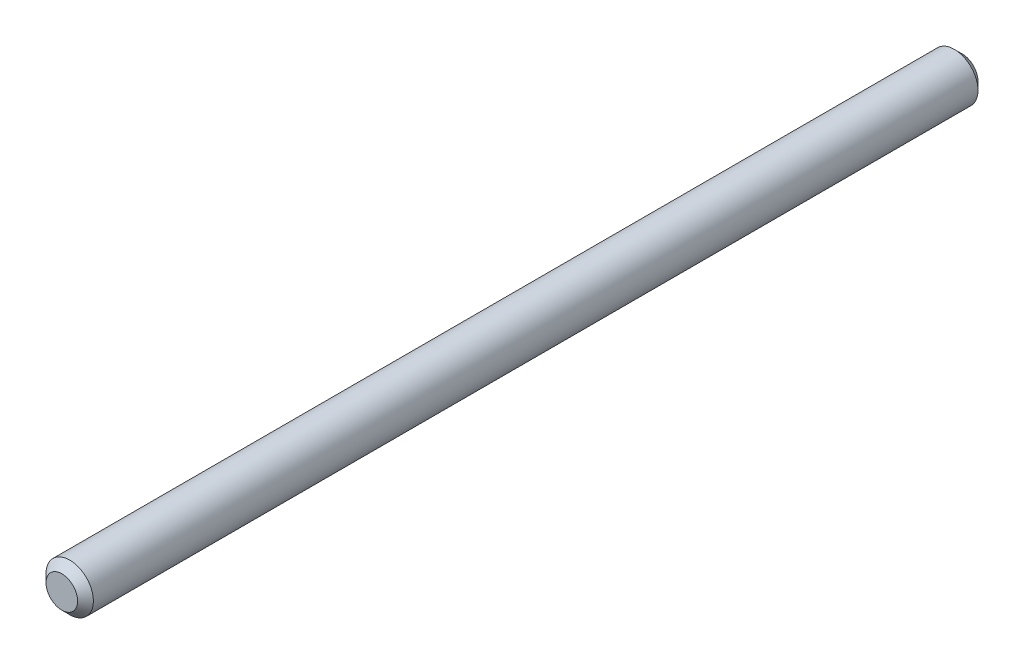
ISO-10303-21;
HEADER;
FILE_DESCRIPTION(('STEP AP214'),'2;1');
FILE_NAME('part.step','',(''),(''),'','','');
FILE_SCHEMA(('AUTOMOTIVE_DESIGN { 1 0 10303 214 1 1 1 1 }'));
ENDSEC;
DATA;
#1=APPLICATION_CONTEXT('core data for automotive mechanical design processes');
#2=APPLICATION_PROTOCOL_DEFINITION('international standard','automotive_design',2000,#1);
#3=PRODUCT_CONTEXT('',#1,'mechanical');
#4=PRODUCT('Part','Part','',(#3));
#5=PRODUCT_RELATED_PRODUCT_CATEGORY('part','',(#4));
#6=PRODUCT_DEFINITION_FORMATION('','',#4);
#7=PRODUCT_DEFINITION_CONTEXT('part definition',#1,'design');
#8=PRODUCT_DEFINITION('design','',#6,#7);
#9=PRODUCT_DEFINITION_SHAPE('','',#8);
#10=(LENGTH_UNIT() NAMED_UNIT(*) SI_UNIT(.MILLI.,.METRE.));
#11=(NAMED_UNIT(*) PLANE_ANGLE_UNIT() SI_UNIT($,.RADIAN.));
#12=(NAMED_UNIT(*) SI_UNIT($,.STERADIAN.) SOLID_ANGLE_UNIT());
#13=UNCERTAINTY_MEASURE_WITH_UNIT(LENGTH_MEASURE(1.E-05),#10,'distance_accuracy_value','');
#14=(GEOMETRIC_REPRESENTATION_CONTEXT(3) GLOBAL_UNCERTAINTY_ASSIGNED_CONTEXT((#13)) GLOBAL_UNIT_ASSIGNED_CONTEXT((#10,
#11,#12)) REPRESENTATION_CONTEXT('',''));
#15=CARTESIAN_POINT('',(0.,0.,0.));
#16=DIRECTION('',(0.,0.,1.));
#17=DIRECTION('',(1.,0.,0.));
#18=AXIS2_PLACEMENT_3D('',#15,#16,#17);
#19=CARTESIAN_POINT('',(0.,0.,114.));
#20=DIRECTION('',(0.,0.,-1.));
#21=DIRECTION('',(-1.,0.,0.));
#22=AXIS2_PLACEMENT_3D('',#19,#20,#21);
#23=CYLINDRICAL_SURFACE('',#22,3.);
#24=CARTESIAN_POINT('',(0.,0.,113.));
#25=DIRECTION('',(0.,0.,1.));
#26=DIRECTION('',(1.,0.,0.));
#27=AXIS2_PLACEMENT_3D('',#24,#25,#26);
#28=CIRCLE('',#27,3.);
#29=CARTESIAN_POINT('',(-3.,0.,113.));
#30=VERTEX_POINT('',#29);
#31=EDGE_CURVE('E43',#30,#30,#28,.F.);
#32=CARTESIAN_POINT('',(0.,0.,1.00000000000008));
#33=DIRECTION('',(0.,0.,1.));
#34=DIRECTION('',(1.,0.,0.));
#35=AXIS2_PLACEMENT_3D('',#32,#33,#34);
#36=CIRCLE('',#35,3.);
#37=CARTESIAN_POINT('',(-3.,0.,1.00000000000008));
#38=VERTEX_POINT('',#37);
#39=EDGE_CURVE('E48',#38,#38,#36,.T.);
#40=CARTESIAN_POINT('',(-3.,0.,113.));
#41=CARTESIAN_POINT('',(-3.,0.,111.833333333333));
#42=CARTESIAN_POINT('',(-3.,0.,110.666666666667));
#43=CARTESIAN_POINT('',(-3.,0.,108.333333333333));
#44=CARTESIAN_POINT('',(-3.,0.,107.166666666667));
#45=CARTESIAN_POINT('',(-3.,0.,104.833333333333));
#46=CARTESIAN_POINT('',(-3.,0.,103.666666666667));
#47=CARTESIAN_POINT('',(-3.,0.,101.333333333333));
#48=CARTESIAN_POINT('',(-3.,0.,100.166666666667));
#49=CARTESIAN_POINT('',(-3.,0.,97.8333333333334));
#50=CARTESIAN_POINT('',(-3.,0.,96.6666666666667));
#51=CARTESIAN_POINT('',(-3.,0.,94.3333333333334));
#52=CARTESIAN_POINT('',(-3.,0.,93.1666666666667));
#53=CARTESIAN_POINT('',(-3.,0.,90.8333333333334));
#54=CARTESIAN_POINT('',(-3.,0.,89.6666666666667));
#55=CARTESIAN_POINT('',(-3.,0.,87.3333333333334));
#56=CARTESIAN_POINT('',(-3.,0.,86.1666666666667));
#57=CARTESIAN_POINT('',(-3.,0.,83.8333333333334));
#58=CARTESIAN_POINT('',(-3.,0.,82.6666666666667));
#59=CARTESIAN_POINT('',(-3.,0.,80.3333333333334));
#60=CARTESIAN_POINT('',(-3.,0.,79.1666666666667));
#61=CARTESIAN_POINT('',(-3.,0.,76.8333333333334));
#62=CARTESIAN_POINT('',(-3.,0.,75.6666666666667));
#63=CARTESIAN_POINT('',(-3.,0.,73.3333333333334));
#64=CARTESIAN_POINT('',(-3.,0.,72.1666666666667));
#65=CARTESIAN_POINT('',(-3.,0.,69.8333333333334));
#66=CARTESIAN_POINT('',(-3.,0.,68.6666666666667));
#67=CARTESIAN_POINT('',(-3.,0.,66.3333333333334));
#68=CARTESIAN_POINT('',(-3.,0.,65.1666666666667));
#69=CARTESIAN_POINT('',(-3.,0.,62.8333333333334));
#70=CARTESIAN_POINT('',(-3.,0.,61.6666666666667));
#71=CARTESIAN_POINT('',(-3.,0.,59.3333333333334));
#72=CARTESIAN_POINT('',(-3.,0.,58.1666666666667));
#73=CARTESIAN_POINT('',(-3.,0.,55.8333333333334));
#74=CARTESIAN_POINT('',(-3.,0.,54.6666666666667));
#75=CARTESIAN_POINT('',(-3.,0.,52.3333333333334));
#76=CARTESIAN_POINT('',(-3.,0.,51.1666666666667));
#77=CARTESIAN_POINT('',(-3.,0.,48.8333333333334));
#78=CARTESIAN_POINT('',(-3.,0.,47.6666666666667));
#79=CARTESIAN_POINT('',(-3.,0.,45.3333333333334));
#80=CARTESIAN_POINT('',(-3.,0.,44.1666666666667));
#81=CARTESIAN_POINT('',(-3.,0.,41.8333333333334));
#82=CARTESIAN_POINT('',(-3.,0.,40.6666666666667));
#83=CARTESIAN_POINT('',(-3.,0.,38.3333333333334));
#84=CARTESIAN_POINT('',(-3.,0.,37.1666666666667));
#85=CARTESIAN_POINT('',(-3.,0.,34.8333333333334));
#86=CARTESIAN_POINT('',(-3.,0.,33.6666666666668));
#87=CARTESIAN_POINT('',(-3.,0.,31.3333333333334));
#88=CARTESIAN_POINT('',(-3.,0.,30.1666666666667));
#89=CARTESIAN_POINT('',(-3.,0.,27.8333333333334));
#90=CARTESIAN_POINT('',(-3.,0.,26.6666666666667));
#91=CARTESIAN_POINT('',(-3.,0.,24.3333333333334));
#92=CARTESIAN_POINT('',(-3.,0.,23.1666666666667));
#93=CARTESIAN_POINT('',(-3.,0.,20.8333333333334));
#94=CARTESIAN_POINT('',(-3.,0.,19.6666666666667));
#95=CARTESIAN_POINT('',(-3.,0.,17.3333333333334));
#96=CARTESIAN_POINT('',(-3.,0.,16.1666666666667));
#97=CARTESIAN_POINT('',(-3.,0.,13.8333333333334));
#98=CARTESIAN_POINT('',(-3.,0.,12.6666666666667));
#99=CARTESIAN_POINT('',(-3.,0.,10.3333333333334));
#100=CARTESIAN_POINT('',(-3.,0.,9.16666666666675));
#101=CARTESIAN_POINT('',(-3.,0.,6.83333333333342));
#102=CARTESIAN_POINT('',(-3.,0.,5.66666666666676));
#103=CARTESIAN_POINT('',(-3.,0.,3.33333333333342));
#104=CARTESIAN_POINT('',(-3.,0.,2.16666666666675));
#105=CARTESIAN_POINT('',(-3.,0.,1.00000000000008));
#106=B_SPLINE_CURVE_WITH_KNOTS('',3,(#40,#41,#42,#43,#44,#45,#46,#47,#48,#49,#50,#51,#52,#53,
#54,#55,#56,#57,#58,#59,#60,#61,#62,#63,#64,#65,#66,#67,#68,#69,#70,#71,#72,#73,#74,#75,#76,#77,
#78,#79,#80,#81,#82,#83,#84,#85,#86,#87,#88,#89,#90,#91,#92,#93,#94,#95,#96,#97,#98,#99,#100,
#101,#102,#103,#104,#105),.UNSPECIFIED.,.F.,.F.,(4,2,2,2,2,2,2,2,2,2,2,2,2,2,2,2,2,2,2,2,2,2,2,
2,2,2,2,2,2,2,2,2,4),(0.,3.49999999999999,6.99999999999999,10.5,14.,17.5,21.,24.5,28.,31.5,35.,
38.5,42.,45.5,49.,52.5,56.,59.5,63.,66.5,70.,73.5,77.,80.5,84.,87.5,91.,94.5,98.,101.5,105.,
108.5,112.),.UNSPECIFIED.);
#107=EDGE_CURVE('BSEAM35',#30,#38,#106,.T.);
#108=ORIENTED_EDGE('',*,*,#31,.T.);
#109=ORIENTED_EDGE('',*,*,#39,.T.);
#110=ORIENTED_EDGE('',*,*,#107,.T.);
#111=ORIENTED_EDGE('',*,*,#107,.F.);
#112=EDGE_LOOP('',(#108,#110,#109,#111));
#113=FACE_BOUND('',#112,.T.);
#114=ADVANCED_FACE('F35',(#113),#23,.T.);
#115=CARTESIAN_POINT('',(0.,0.,114.));
#116=DIRECTION('',(0.,0.,1.));
#117=DIRECTION('',(1.,0.,0.));
#118=AXIS2_PLACEMENT_3D('',#115,#116,#117);
#119=PLANE('',#118);
#120=CARTESIAN_POINT('',(0.,0.,114.));
#121=DIRECTION('',(0.,0.,1.));
#122=DIRECTION('',(1.,0.,0.));
#123=AXIS2_PLACEMENT_3D('',#120,#121,#122);
#124=CIRCLE('',#123,2.00000000000007);
#125=CARTESIAN_POINT('',(2.00000000000007,0.,114.));
#126=VERTEX_POINT('',#125);
#127=EDGE_CURVE('E53',#126,#126,#124,.T.);
#128=ORIENTED_EDGE('',*,*,#127,.T.);
#129=EDGE_LOOP('',(#128));
#130=FACE_BOUND('',#129,.T.);
#131=ADVANCED_FACE('F60',(#130),#119,.T.);
#132=CARTESIAN_POINT('',(0.,0.,0.));
#133=DIRECTION('',(0.,0.,1.));
#134=DIRECTION('',(1.,0.,0.));
#135=AXIS2_PLACEMENT_3D('',#132,#133,#134);
#136=PLANE('',#135);
#137=CARTESIAN_POINT('',(0.,0.,0.));
#138=DIRECTION('',(0.,0.,1.));
#139=DIRECTION('',(1.,0.,0.));
#140=AXIS2_PLACEMENT_3D('',#137,#138,#139);
#141=CIRCLE('',#140,1.99999999999992);
#142=CARTESIAN_POINT('',(1.99999999999992,0.,0.));
#143=VERTEX_POINT('',#142);
#144=EDGE_CURVE('E10',#143,#143,#141,.F.);
#145=ORIENTED_EDGE('',*,*,#144,.T.);
#146=EDGE_LOOP('',(#145));
#147=FACE_BOUND('',#146,.T.);
#148=ADVANCED_FACE('F64',(#147),#136,.F.);
#149=CARTESIAN_POINT('',(0.,0.,114.));
#150=DIRECTION('',(0.,0.,-1.));
#151=DIRECTION('',(-1.,0.,0.));
#152=AXIS2_PLACEMENT_3D('',#149,#150,#151);
#153=CONICAL_SURFACE('',#152,2.00000000000007,0.785398163397447);
#154=ORIENTED_EDGE('',*,*,#31,.F.);
#155=EDGE_LOOP('',(#154));
#156=FACE_BOUND('',#155,.T.);
#157=ORIENTED_EDGE('',*,*,#127,.F.);
#158=EDGE_LOOP('',(#157));
#159=FACE_BOUND('',#158,.T.);
#160=ADVANCED_FACE('F62',(#156,#159),#153,.T.);
#161=CARTESIAN_POINT('',(0.,0.,1.00000000000008));
#162=DIRECTION('',(0.,0.,1.));
#163=DIRECTION('',(1.,0.,0.));
#164=AXIS2_PLACEMENT_3D('',#161,#162,#163);
#165=CONICAL_SURFACE('',#164,3.,0.785398163397447);
#166=ORIENTED_EDGE('',*,*,#144,.F.);
#167=EDGE_LOOP('',(#166));
#168=FACE_BOUND('',#167,.T.);
#169=ORIENTED_EDGE('',*,*,#39,.F.);
#170=EDGE_LOOP('',(#169));
#171=FACE_BOUND('',#170,.T.);
#172=ADVANCED_FACE('F37',(#168,#171),#165,.T.);
#173=CLOSED_SHELL('',(#114,#131,#148,#160,#172));
#174=MANIFOLD_SOLID_BREP('B2',#173);
#175=ADVANCED_BREP_SHAPE_REPRESENTATION('',(#18,#174),#14);
#176=SHAPE_DEFINITION_REPRESENTATION(#9,#175);
ENDSEC;
END-ISO-10303-21;
